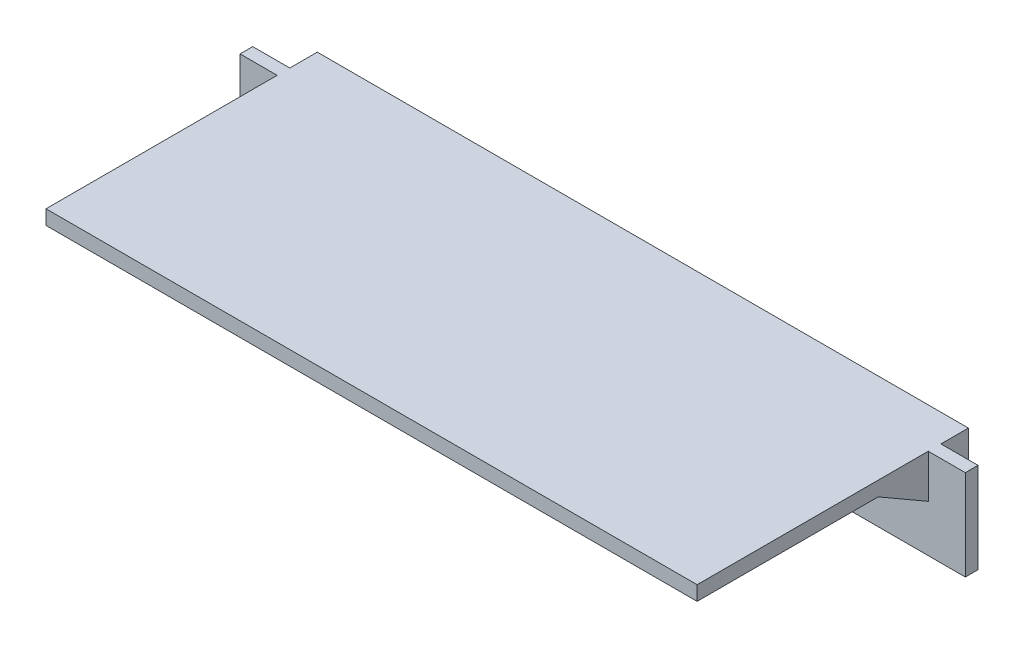
ISO-10303-21;
HEADER;
FILE_DESCRIPTION(('STEP AP214'),'2;1');
FILE_NAME('part.step','',(''),(''),'','','');
FILE_SCHEMA(('AUTOMOTIVE_DESIGN { 1 0 10303 214 1 1 1 1 }'));
ENDSEC;
DATA;
#1=APPLICATION_CONTEXT('core data for automotive mechanical design processes');
#2=APPLICATION_PROTOCOL_DEFINITION('international standard','automotive_design',2000,#1);
#3=PRODUCT_CONTEXT('',#1,'mechanical');
#4=PRODUCT('Part','Part','',(#3));
#5=PRODUCT_RELATED_PRODUCT_CATEGORY('part','',(#4));
#6=PRODUCT_DEFINITION_FORMATION('','',#4);
#7=PRODUCT_DEFINITION_CONTEXT('part definition',#1,'design');
#8=PRODUCT_DEFINITION('design','',#6,#7);
#9=PRODUCT_DEFINITION_SHAPE('','',#8);
#10=(LENGTH_UNIT() NAMED_UNIT(*) SI_UNIT(.MILLI.,.METRE.));
#11=(NAMED_UNIT(*) PLANE_ANGLE_UNIT() SI_UNIT($,.RADIAN.));
#12=(NAMED_UNIT(*) SI_UNIT($,.STERADIAN.) SOLID_ANGLE_UNIT());
#13=UNCERTAINTY_MEASURE_WITH_UNIT(LENGTH_MEASURE(1.E-05),#10,'distance_accuracy_value','');
#14=(GEOMETRIC_REPRESENTATION_CONTEXT(3) GLOBAL_UNCERTAINTY_ASSIGNED_CONTEXT((#13)) GLOBAL_UNIT_ASSIGNED_CONTEXT((#10,
#11,#12)) REPRESENTATION_CONTEXT('',''));
#15=CARTESIAN_POINT('',(0.,0.,0.));
#16=DIRECTION('',(0.,0.,1.));
#17=DIRECTION('',(1.,0.,0.));
#18=AXIS2_PLACEMENT_3D('',#15,#16,#17);
#19=CARTESIAN_POINT('',(90.0000000000004,25.,65.65));
#20=DIRECTION('',(-1.,0.,0.));
#21=DIRECTION('',(0.,0.,1.));
#22=AXIS2_PLACEMENT_3D('',#19,#20,#21);
#23=PLANE('',#22);
#24=DIRECTION('',(0.,0.,-1.));
#25=VECTOR('',#24,1.);
#26=CARTESIAN_POINT('',(90.0000000000004,25.,65.65));
#27=LINE('',#26,#25);
#28=CARTESIAN_POINT('',(90.0000000000005,25.,-1.75));
#29=VERTEX_POINT('',#28);
#30=CARTESIAN_POINT('',(90.0000000000005,25.,-9.35000000000001));
#31=VERTEX_POINT('',#30);
#32=EDGE_CURVE('E174',#29,#31,#27,.T.);
#33=ORIENTED_EDGE('',*,*,#32,.F.);
#34=DIRECTION('',(0.,1.,0.));
#35=VECTOR('',#34,1.);
#36=CARTESIAN_POINT('',(90.0000000000005,25.,-1.75000000000002));
#37=LINE('',#36,#35);
#38=CARTESIAN_POINT('',(90.0000000000005,12.9999999999999,-1.75000000000001));
#39=VERTEX_POINT('',#38);
#40=EDGE_CURVE('E56',#39,#29,#37,.T.);
#41=ORIENTED_EDGE('',*,*,#40,.F.);
#42=DIRECTION('',(0.,-0.499999999999997,0.866025403784441));
#43=VECTOR('',#42,1.);
#44=CARTESIAN_POINT('',(90.0000000000004,-13.1850561075356,43.6038475772936));
#45=LINE('',#44,#43);
#46=CARTESIAN_POINT('',(90.0000000000005,17.387862045841,-9.35000000000001));
#47=VERTEX_POINT('',#46);
#48=EDGE_CURVE('E234',#39,#47,#45,.F.);
#49=ORIENTED_EDGE('',*,*,#48,.T.);
#50=DIRECTION('',(0.,-1.,0.));
#51=VECTOR('',#50,1.);
#52=CARTESIAN_POINT('',(90.0000000000005,25.,-9.35000000000001));
#53=LINE('',#52,#51);
#54=EDGE_CURVE('E195',#31,#47,#53,.T.);
#55=ORIENTED_EDGE('',*,*,#54,.F.);
#56=EDGE_LOOP('',(#33,#41,#49,#55));
#57=FACE_BOUND('',#56,.T.);
#58=ADVANCED_FACE('F40',(#57),#23,.F.);
#59=DIRECTION('',(0.,-1.,0.));
#60=VECTOR('',#59,1.);
#61=CARTESIAN_POINT('',(90.0000000000005,25.,1.74999999999999));
#62=LINE('',#61,#60);
#63=CARTESIAN_POINT('',(90.0000000000004,25.,1.74999999999999));
#64=VERTEX_POINT('',#63);
#65=CARTESIAN_POINT('',(90.0000000000005,13.,1.74999999999999));
#66=VERTEX_POINT('',#65);
#67=EDGE_CURVE('E226',#64,#66,#62,.T.);
#68=ORIENTED_EDGE('',*,*,#67,.F.);
#69=CARTESIAN_POINT('',(90.0000000000004,25.,65.65));
#70=VERTEX_POINT('',#69);
#71=EDGE_CURVE('E176',#70,#64,#27,.T.);
#72=ORIENTED_EDGE('',*,*,#71,.F.);
#73=DIRECTION('',(0.,-1.,0.));
#74=VECTOR('',#73,1.);
#75=CARTESIAN_POINT('',(90.0000000000004,25.,65.65));
#76=LINE('',#75,#74);
#77=CARTESIAN_POINT('',(90.0000000000004,21.,65.65));
#78=VERTEX_POINT('',#77);
#79=EDGE_CURVE('E197',#70,#78,#76,.T.);
#80=ORIENTED_EDGE('',*,*,#79,.T.);
#81=DIRECTION('',(0.,0.,-1.));
#82=VECTOR('',#81,1.);
#83=CARTESIAN_POINT('',(90.0000000000004,21.,65.65));
#84=LINE('',#83,#82);
#85=CARTESIAN_POINT('',(90.0000000000004,21.,15.6064064605512));
#86=VERTEX_POINT('',#85);
#87=EDGE_CURVE('E187',#78,#86,#84,.T.);
#88=ORIENTED_EDGE('',*,*,#87,.T.);
#89=DIRECTION('',(0.,0.499999999999995,0.866025403784442));
#90=VECTOR('',#89,1.);
#91=CARTESIAN_POINT('',(90.0000000000004,43.6695116509126,54.8711524227069));
#92=LINE('',#91,#90);
#93=EDGE_CURVE('E49',#86,#66,#92,.F.);
#94=ORIENTED_EDGE('',*,*,#93,.T.);
#95=EDGE_LOOP('',(#68,#72,#80,#88,#94));
#96=FACE_BOUND('',#95,.T.);
#97=ADVANCED_FACE('F237',(#96),#23,.F.);
#98=CARTESIAN_POINT('',(-89.9999999999996,25.,-9.35000000000001));
#99=DIRECTION('',(1.,0.,0.));
#100=DIRECTION('',(0.,0.,-1.));
#101=AXIS2_PLACEMENT_3D('',#98,#99,#100);
#102=PLANE('',#101);
#103=DIRECTION('',(0.,0.,1.));
#104=VECTOR('',#103,1.);
#105=CARTESIAN_POINT('',(-89.9999999999996,25.,-9.35000000000001));
#106=LINE('',#105,#104);
#107=CARTESIAN_POINT('',(-89.9999999999996,25.,1.75000000000001));
#108=VERTEX_POINT('',#107);
#109=CARTESIAN_POINT('',(-89.9999999999996,25.,65.65));
#110=VERTEX_POINT('',#109);
#111=EDGE_CURVE('E180',#108,#110,#106,.T.);
#112=ORIENTED_EDGE('',*,*,#111,.F.);
#113=DIRECTION('',(0.,1.,0.));
#114=VECTOR('',#113,1.);
#115=CARTESIAN_POINT('',(-89.9999999999996,25.,1.75000000000001));
#116=LINE('',#115,#114);
#117=CARTESIAN_POINT('',(-89.9999999999996,13.,1.75000000000001));
#118=VERTEX_POINT('',#117);
#119=EDGE_CURVE('E64',#118,#108,#116,.T.);
#120=ORIENTED_EDGE('',*,*,#119,.F.);
#121=DIRECTION('',(0.,-0.499999999999995,-0.866025403784442));
#122=VECTOR('',#121,1.);
#123=CARTESIAN_POINT('',(-89.9999999999996,11.1935590089963,-1.37884757729347));
#124=LINE('',#123,#122);
#125=CARTESIAN_POINT('',(-89.9999999999996,21.,15.6064064605512));
#126=VERTEX_POINT('',#125);
#127=EDGE_CURVE('E11',#118,#126,#124,.F.);
#128=ORIENTED_EDGE('',*,*,#127,.T.);
#129=DIRECTION('',(0.,0.,1.));
#130=VECTOR('',#129,1.);
#131=CARTESIAN_POINT('',(-89.9999999999996,21.,-9.35000000000001));
#132=LINE('',#131,#130);
#133=CARTESIAN_POINT('',(-89.9999999999996,21.,65.65));
#134=VERTEX_POINT('',#133);
#135=EDGE_CURVE('E175',#126,#134,#132,.T.);
#136=ORIENTED_EDGE('',*,*,#135,.T.);
#137=DIRECTION('',(0.,-1.,0.));
#138=VECTOR('',#137,1.);
#139=CARTESIAN_POINT('',(-89.9999999999996,25.,65.65));
#140=LINE('',#139,#138);
#141=EDGE_CURVE('E184',#110,#134,#140,.T.);
#142=ORIENTED_EDGE('',*,*,#141,.F.);
#143=EDGE_LOOP('',(#112,#120,#128,#136,#142));
#144=FACE_BOUND('',#143,.T.);
#145=ADVANCED_FACE('F246',(#144),#102,.F.);
#146=DIRECTION('',(0.,-1.,0.));
#147=VECTOR('',#146,1.);
#148=CARTESIAN_POINT('',(-89.9999999999996,25.,-1.74999999999999));
#149=LINE('',#148,#147);
#150=CARTESIAN_POINT('',(-89.9999999999995,25.,-1.74999999999999));
#151=VERTEX_POINT('',#150);
#152=CARTESIAN_POINT('',(-89.9999999999996,12.9999999999999,-1.74999999999999));
#153=VERTEX_POINT('',#152);
#154=EDGE_CURVE('E217',#151,#153,#149,.T.);
#155=ORIENTED_EDGE('',*,*,#154,.F.);
#156=CARTESIAN_POINT('',(-89.9999999999996,25.,-9.35000000000001));
#157=VERTEX_POINT('',#156);
#158=EDGE_CURVE('E181',#157,#151,#106,.T.);
#159=ORIENTED_EDGE('',*,*,#158,.F.);
#160=DIRECTION('',(0.,-1.,0.));
#161=VECTOR('',#160,1.);
#162=CARTESIAN_POINT('',(-89.9999999999996,25.,-9.35000000000001));
#163=LINE('',#162,#161);
#164=CARTESIAN_POINT('',(-89.9999999999996,17.387862045841,-9.35000000000001));
#165=VERTEX_POINT('',#164);
#166=EDGE_CURVE('E193',#157,#165,#163,.T.);
#167=ORIENTED_EDGE('',*,*,#166,.T.);
#168=DIRECTION('',(0.,0.499999999999997,-0.866025403784441));
#169=VECTOR('',#168,1.);
#170=CARTESIAN_POINT('',(-89.9999999999996,19.2908965343807,-12.6461524227067));
#171=LINE('',#170,#169);
#172=EDGE_CURVE('E232',#165,#153,#171,.F.);
#173=ORIENTED_EDGE('',*,*,#172,.T.);
#174=EDGE_LOOP('',(#155,#159,#167,#173));
#175=FACE_BOUND('',#174,.T.);
#176=ADVANCED_FACE('F266',(#175),#102,.F.);
#177=CARTESIAN_POINT('',(-100.25,21.,1.75000000000002));
#178=DIRECTION('',(1.,0.,0.));
#179=DIRECTION('',(0.,0.,-1.));
#180=AXIS2_PLACEMENT_3D('',#177,#178,#179);
#181=PLANE('',#180);
#182=DIRECTION('',(0.,0.,1.));
#183=VECTOR('',#182,1.);
#184=CARTESIAN_POINT('',(-100.25,0.,1.75000000000002));
#185=LINE('',#184,#183);
#186=CARTESIAN_POINT('',(-100.25,0.,-1.74999999999999));
#187=VERTEX_POINT('',#186);
#188=CARTESIAN_POINT('',(-100.25,0.,1.75000000000002));
#189=VERTEX_POINT('',#188);
#190=EDGE_CURVE('E200',#187,#189,#185,.T.);
#191=ORIENTED_EDGE('',*,*,#190,.T.);
#192=DIRECTION('',(0.,-1.,0.));
#193=VECTOR('',#192,1.);
#194=CARTESIAN_POINT('',(-100.25,21.,1.75000000000002));
#195=LINE('',#194,#193);
#196=CARTESIAN_POINT('',(-100.25,25.,1.75000000000002));
#197=VERTEX_POINT('',#196);
#198=EDGE_CURVE('E211',#197,#189,#195,.T.);
#199=ORIENTED_EDGE('',*,*,#198,.F.);
#200=DIRECTION('',(0.,0.,1.));
#201=VECTOR('',#200,1.);
#202=CARTESIAN_POINT('',(-100.25,25.,-1.74999999999999));
#203=LINE('',#202,#201);
#204=CARTESIAN_POINT('',(-100.25,25.,-1.74999999999999));
#205=VERTEX_POINT('',#204);
#206=EDGE_CURVE('E160',#205,#197,#203,.T.);
#207=ORIENTED_EDGE('',*,*,#206,.F.);
#208=DIRECTION('',(0.,-1.,0.));
#209=VECTOR('',#208,1.);
#210=CARTESIAN_POINT('',(-100.25,21.,-1.74999999999999));
#211=LINE('',#210,#209);
#212=EDGE_CURVE('E148',#205,#187,#211,.T.);
#213=ORIENTED_EDGE('',*,*,#212,.T.);
#214=EDGE_LOOP('',(#191,#199,#207,#213));
#215=FACE_BOUND('',#214,.T.);
#216=ADVANCED_FACE('F258',(#215),#181,.F.);
#217=CARTESIAN_POINT('',(100.25,21.,1.74999999999999));
#218=DIRECTION('',(0.,0.,-1.));
#219=DIRECTION('',(-1.,0.,0.));
#220=AXIS2_PLACEMENT_3D('',#217,#218,#219);
#221=PLANE('',#220);
#222=DIRECTION('',(0.,-1.,0.));
#223=VECTOR('',#222,1.);
#224=CARTESIAN_POINT('',(100.25,21.,1.74999999999999));
#225=LINE('',#224,#223);
#226=CARTESIAN_POINT('',(100.25,25.,1.74999999999999));
#227=VERTEX_POINT('',#226);
#228=CARTESIAN_POINT('',(100.25,0.,1.74999999999999));
#229=VERTEX_POINT('',#228);
#230=EDGE_CURVE('E147',#227,#229,#225,.T.);
#231=ORIENTED_EDGE('',*,*,#230,.F.);
#232=DIRECTION('',(1.,0.,0.));
#233=VECTOR('',#232,1.);
#234=CARTESIAN_POINT('',(90.0000000000004,25.,1.74999999999999));
#235=LINE('',#234,#233);
#236=EDGE_CURVE('E154',#64,#227,#235,.T.);
#237=ORIENTED_EDGE('',*,*,#236,.F.);
#238=ORIENTED_EDGE('',*,*,#67,.T.);
#239=DIRECTION('',(-1.,0.,0.));
#240=VECTOR('',#239,1.);
#241=CARTESIAN_POINT('',(-89.9999999999995,13.,1.75000000000001));
#242=LINE('',#241,#240);
#243=EDGE_CURVE('E224',#66,#118,#242,.T.);
#244=ORIENTED_EDGE('',*,*,#243,.T.);
#245=ORIENTED_EDGE('',*,*,#119,.T.);
#246=DIRECTION('',(1.,0.,0.));
#247=VECTOR('',#246,1.);
#248=CARTESIAN_POINT('',(-100.25,25.,1.75000000000002));
#249=LINE('',#248,#247);
#250=EDGE_CURVE('E163',#197,#108,#249,.T.);
#251=ORIENTED_EDGE('',*,*,#250,.F.);
#252=ORIENTED_EDGE('',*,*,#198,.T.);
#253=DIRECTION('',(1.,0.,0.));
#254=VECTOR('',#253,1.);
#255=CARTESIAN_POINT('',(100.25,0.,1.74999999999999));
#256=LINE('',#255,#254);
#257=EDGE_CURVE('E203',#189,#229,#256,.T.);
#258=ORIENTED_EDGE('',*,*,#257,.T.);
#259=EDGE_LOOP('',(#231,#237,#238,#244,#245,#251,#252,#258));
#260=FACE_BOUND('',#259,.T.);
#261=ADVANCED_FACE('F241',(#260),#221,.F.);
#262=CARTESIAN_POINT('',(100.25,21.,1.74999999999999));
#263=DIRECTION('',(-1.,0.,0.));
#264=DIRECTION('',(0.,0.,1.));
#265=AXIS2_PLACEMENT_3D('',#262,#263,#264);
#266=PLANE('',#265);
#267=DIRECTION('',(0.,0.,-1.));
#268=VECTOR('',#267,1.);
#269=CARTESIAN_POINT('',(100.25,0.,1.74999999999999));
#270=LINE('',#269,#268);
#271=CARTESIAN_POINT('',(100.25,0.,-1.75000000000002));
#272=VERTEX_POINT('',#271);
#273=EDGE_CURVE('E145',#229,#272,#270,.T.);
#274=ORIENTED_EDGE('',*,*,#273,.T.);
#275=DIRECTION('',(0.,-1.,0.));
#276=VECTOR('',#275,1.);
#277=CARTESIAN_POINT('',(100.25,21.,-1.75000000000002));
#278=LINE('',#277,#276);
#279=CARTESIAN_POINT('',(100.25,25.,-1.75000000000002));
#280=VERTEX_POINT('',#279);
#281=EDGE_CURVE('E138',#280,#272,#278,.T.);
#282=ORIENTED_EDGE('',*,*,#281,.F.);
#283=DIRECTION('',(0.,0.,-1.));
#284=VECTOR('',#283,1.);
#285=CARTESIAN_POINT('',(100.25,25.,1.74999999999999));
#286=LINE('',#285,#284);
#287=EDGE_CURVE('E142',#227,#280,#286,.T.);
#288=ORIENTED_EDGE('',*,*,#287,.F.);
#289=ORIENTED_EDGE('',*,*,#230,.T.);
#290=EDGE_LOOP('',(#274,#282,#288,#289));
#291=FACE_BOUND('',#290,.T.);
#292=ADVANCED_FACE('F139',(#291),#266,.F.);
#293=CARTESIAN_POINT('',(100.25,21.,-1.75000000000002));
#294=DIRECTION('',(0.,0.,1.));
#295=DIRECTION('',(1.,0.,0.));
#296=AXIS2_PLACEMENT_3D('',#293,#294,#295);
#297=PLANE('',#296);
#298=ORIENTED_EDGE('',*,*,#212,.F.);
#299=DIRECTION('',(-1.,0.,0.));
#300=VECTOR('',#299,1.);
#301=CARTESIAN_POINT('',(-89.9999999999995,25.,-1.74999999999999));
#302=LINE('',#301,#300);
#303=EDGE_CURVE('E167',#151,#205,#302,.T.);
#304=ORIENTED_EDGE('',*,*,#303,.F.);
#305=ORIENTED_EDGE('',*,*,#154,.T.);
#306=DIRECTION('',(1.,0.,0.));
#307=VECTOR('',#306,1.);
#308=CARTESIAN_POINT('',(90.0000000000005,12.9999999999999,-1.75000000000001));
#309=LINE('',#308,#307);
#310=EDGE_CURVE('E215',#153,#39,#309,.T.);
#311=ORIENTED_EDGE('',*,*,#310,.T.);
#312=ORIENTED_EDGE('',*,*,#40,.T.);
#313=DIRECTION('',(-1.,0.,0.));
#314=VECTOR('',#313,1.);
#315=CARTESIAN_POINT('',(100.25,25.,-1.75000000000002));
#316=LINE('',#315,#314);
#317=EDGE_CURVE('E150',#280,#29,#316,.T.);
#318=ORIENTED_EDGE('',*,*,#317,.F.);
#319=ORIENTED_EDGE('',*,*,#281,.T.);
#320=DIRECTION('',(-1.,0.,0.));
#321=VECTOR('',#320,1.);
#322=CARTESIAN_POINT('',(100.25,0.,-1.75000000000002));
#323=LINE('',#322,#321);
#324=EDGE_CURVE('E206',#272,#187,#323,.T.);
#325=ORIENTED_EDGE('',*,*,#324,.T.);
#326=EDGE_LOOP('',(#298,#304,#305,#311,#312,#318,#319,#325));
#327=FACE_BOUND('',#326,.T.);
#328=ADVANCED_FACE('F151',(#327),#297,.F.);
#329=CARTESIAN_POINT('',(0.,0.,0.));
#330=DIRECTION('',(0.,1.,0.));
#331=DIRECTION('',(0.,0.,1.));
#332=AXIS2_PLACEMENT_3D('',#329,#330,#331);
#333=PLANE('',#332);
#334=ORIENTED_EDGE('',*,*,#190,.F.);
#335=ORIENTED_EDGE('',*,*,#324,.F.);
#336=ORIENTED_EDGE('',*,*,#273,.F.);
#337=ORIENTED_EDGE('',*,*,#257,.F.);
#338=EDGE_LOOP('',(#334,#335,#336,#337));
#339=FACE_BOUND('',#338,.T.);
#340=ADVANCED_FACE('F260',(#339),#333,.F.);
#341=CARTESIAN_POINT('',(0.,21.,0.));
#342=DIRECTION('',(0.,1.,0.));
#343=DIRECTION('',(0.,0.,1.));
#344=AXIS2_PLACEMENT_3D('',#341,#342,#343);
#345=PLANE('',#344);
#346=ORIENTED_EDGE('',*,*,#135,.F.);
#347=DIRECTION('',(1.,0.,0.));
#348=VECTOR('',#347,1.);
#349=CARTESIAN_POINT('',(90.0000000000004,21.,15.6064064605512));
#350=LINE('',#349,#348);
#351=EDGE_CURVE('E220',#126,#86,#350,.T.);
#352=ORIENTED_EDGE('',*,*,#351,.T.);
#353=ORIENTED_EDGE('',*,*,#87,.F.);
#354=DIRECTION('',(1.,0.,0.));
#355=VECTOR('',#354,1.);
#356=CARTESIAN_POINT('',(-89.9999999999996,21.,65.65));
#357=LINE('',#356,#355);
#358=EDGE_CURVE('E170',#134,#78,#357,.T.);
#359=ORIENTED_EDGE('',*,*,#358,.F.);
#360=EDGE_LOOP('',(#346,#352,#353,#359));
#361=FACE_BOUND('',#360,.T.);
#362=ADVANCED_FACE('F250',(#361),#345,.F.);
#363=CARTESIAN_POINT('',(-89.9999999999996,25.,65.65));
#364=DIRECTION('',(0.,0.,-1.));
#365=DIRECTION('',(-1.,0.,0.));
#366=AXIS2_PLACEMENT_3D('',#363,#364,#365);
#367=PLANE('',#366);
#368=ORIENTED_EDGE('',*,*,#358,.T.);
#369=ORIENTED_EDGE('',*,*,#79,.F.);
#370=DIRECTION('',(1.,0.,0.));
#371=VECTOR('',#370,1.);
#372=CARTESIAN_POINT('',(-89.9999999999996,25.,65.65));
#373=LINE('',#372,#371);
#374=EDGE_CURVE('E172',#110,#70,#373,.T.);
#375=ORIENTED_EDGE('',*,*,#374,.F.);
#376=ORIENTED_EDGE('',*,*,#141,.T.);
#377=EDGE_LOOP('',(#368,#369,#375,#376));
#378=FACE_BOUND('',#377,.T.);
#379=ADVANCED_FACE('F253',(#378),#367,.F.);
#380=CARTESIAN_POINT('',(-89.9999999999996,25.,-9.35000000000001));
#381=DIRECTION('',(0.,0.,1.));
#382=DIRECTION('',(1.,0.,0.));
#383=AXIS2_PLACEMENT_3D('',#380,#381,#382);
#384=PLANE('',#383);
#385=ORIENTED_EDGE('',*,*,#54,.T.);
#386=DIRECTION('',(1.,0.,0.));
#387=VECTOR('',#386,1.);
#388=CARTESIAN_POINT('',(-89.9999999999996,17.387862045841,-9.35000000000001));
#389=LINE('',#388,#387);
#390=EDGE_CURVE('E229',#47,#165,#389,.F.);
#391=ORIENTED_EDGE('',*,*,#390,.T.);
#392=ORIENTED_EDGE('',*,*,#166,.F.);
#393=DIRECTION('',(-1.,0.,0.));
#394=VECTOR('',#393,1.);
#395=CARTESIAN_POINT('',(-89.9999999999996,25.,-9.35000000000001));
#396=LINE('',#395,#394);
#397=EDGE_CURVE('E178',#31,#157,#396,.T.);
#398=ORIENTED_EDGE('',*,*,#397,.F.);
#399=EDGE_LOOP('',(#385,#391,#392,#398));
#400=FACE_BOUND('',#399,.T.);
#401=ADVANCED_FACE('F275',(#400),#384,.F.);
#402=CARTESIAN_POINT('',(0.,25.,0.));
#403=DIRECTION('',(0.,1.,0.));
#404=DIRECTION('',(0.,0.,1.));
#405=AXIS2_PLACEMENT_3D('',#402,#403,#404);
#406=PLANE('',#405);
#407=ORIENTED_EDGE('',*,*,#374,.T.);
#408=ORIENTED_EDGE('',*,*,#71,.T.);
#409=ORIENTED_EDGE('',*,*,#236,.T.);
#410=ORIENTED_EDGE('',*,*,#287,.T.);
#411=ORIENTED_EDGE('',*,*,#317,.T.);
#412=ORIENTED_EDGE('',*,*,#32,.T.);
#413=ORIENTED_EDGE('',*,*,#397,.T.);
#414=ORIENTED_EDGE('',*,*,#158,.T.);
#415=ORIENTED_EDGE('',*,*,#303,.T.);
#416=ORIENTED_EDGE('',*,*,#206,.T.);
#417=ORIENTED_EDGE('',*,*,#250,.T.);
#418=ORIENTED_EDGE('',*,*,#111,.T.);
#419=EDGE_LOOP('',(#407,#408,#409,#410,#411,#412,#413,#414,#415,#416,#417,#418));
#420=FACE_BOUND('',#419,.T.);
#421=ADVANCED_FACE('F157',(#420),#406,.T.);
#422=CARTESIAN_POINT('',(0.,21.,-15.6064064605513));
#423=DIRECTION('',(0.,-0.866025403784441,-0.499999999999996));
#424=DIRECTION('',(1.,0.,0.));
#425=AXIS2_PLACEMENT_3D('',#422,#423,#424);
#426=PLANE('',#425);
#427=ORIENTED_EDGE('',*,*,#48,.F.);
#428=ORIENTED_EDGE('',*,*,#310,.F.);
#429=ORIENTED_EDGE('',*,*,#172,.F.);
#430=ORIENTED_EDGE('',*,*,#390,.F.);
#431=EDGE_LOOP('',(#427,#428,#429,#430));
#432=FACE_BOUND('',#431,.T.);
#433=ADVANCED_FACE('F270',(#432),#426,.T.);
#434=CARTESIAN_POINT('',(0.,21.,15.6064064605512));
#435=DIRECTION('',(0.,-0.866025403784442,0.499999999999995));
#436=DIRECTION('',(-1.,0.,0.));
#437=AXIS2_PLACEMENT_3D('',#434,#435,#436);
#438=PLANE('',#437);
#439=ORIENTED_EDGE('',*,*,#127,.F.);
#440=ORIENTED_EDGE('',*,*,#243,.F.);
#441=ORIENTED_EDGE('',*,*,#93,.F.);
#442=ORIENTED_EDGE('',*,*,#351,.F.);
#443=EDGE_LOOP('',(#439,#440,#441,#442));
#444=FACE_BOUND('',#443,.T.);
#445=ADVANCED_FACE('F43',(#444),#438,.T.);
#446=CLOSED_SHELL('',(#58,#97,#145,#176,#216,#261,#292,#328,#340,#362,#379,#401,#421,#433,#445));
#447=MANIFOLD_SOLID_BREP('B2',#446);
#448=ADVANCED_BREP_SHAPE_REPRESENTATION('',(#18,#447),#14);
#449=SHAPE_DEFINITION_REPRESENTATION(#9,#448);
ENDSEC;
END-ISO-10303-21;
